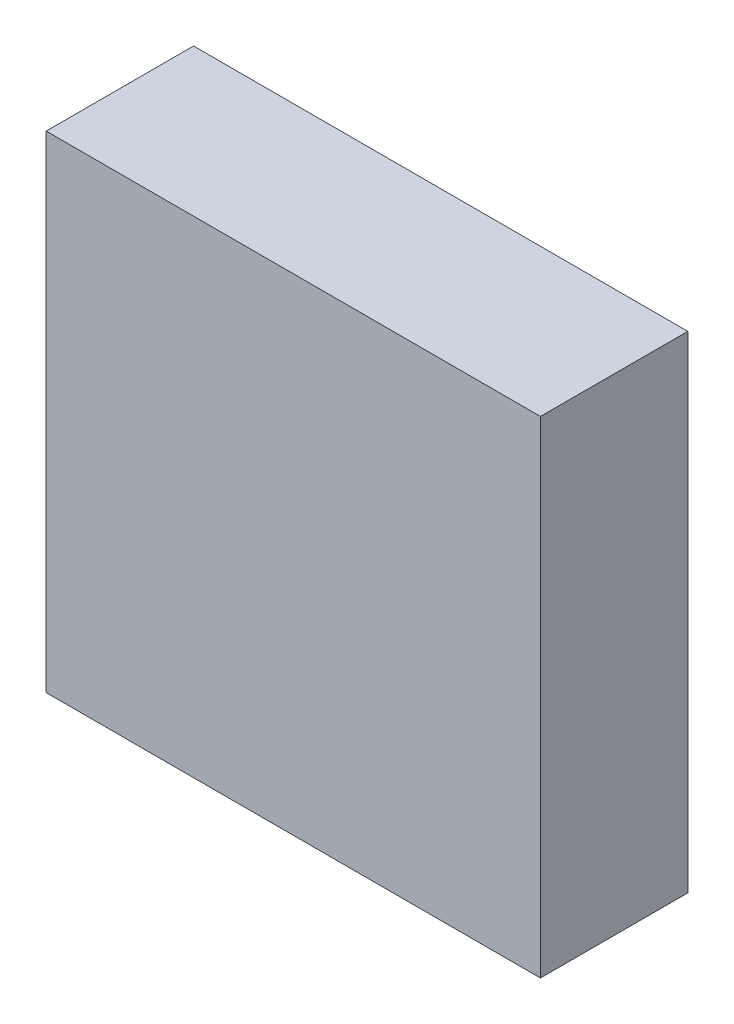
ISO-10303-21;
HEADER;
FILE_DESCRIPTION(('STEP AP214'),'2;1');
FILE_NAME('part.step','',(''),(''),'','','');
FILE_SCHEMA(('AUTOMOTIVE_DESIGN { 1 0 10303 214 1 1 1 1 }'));
ENDSEC;
DATA;
#1=APPLICATION_CONTEXT('core data for automotive mechanical design processes');
#2=APPLICATION_PROTOCOL_DEFINITION('international standard','automotive_design',2000,#1);
#3=PRODUCT_CONTEXT('',#1,'mechanical');
#4=PRODUCT('Part','Part','',(#3));
#5=PRODUCT_RELATED_PRODUCT_CATEGORY('part','',(#4));
#6=PRODUCT_DEFINITION_FORMATION('','',#4);
#7=PRODUCT_DEFINITION_CONTEXT('part definition',#1,'design');
#8=PRODUCT_DEFINITION('design','',#6,#7);
#9=PRODUCT_DEFINITION_SHAPE('','',#8);
#10=(LENGTH_UNIT() NAMED_UNIT(*) SI_UNIT(.MILLI.,.METRE.));
#11=(NAMED_UNIT(*) PLANE_ANGLE_UNIT() SI_UNIT($,.RADIAN.));
#12=(NAMED_UNIT(*) SI_UNIT($,.STERADIAN.) SOLID_ANGLE_UNIT());
#13=UNCERTAINTY_MEASURE_WITH_UNIT(LENGTH_MEASURE(1.E-05),#10,'distance_accuracy_value','');
#14=(GEOMETRIC_REPRESENTATION_CONTEXT(3) GLOBAL_UNCERTAINTY_ASSIGNED_CONTEXT((#13)) GLOBAL_UNIT_ASSIGNED_CONTEXT((#10,
#11,#12)) REPRESENTATION_CONTEXT('',''));
#15=CARTESIAN_POINT('',(0.,0.,0.));
#16=DIRECTION('',(0.,0.,1.));
#17=DIRECTION('',(1.,0.,0.));
#18=AXIS2_PLACEMENT_3D('',#15,#16,#17);
#19=CARTESIAN_POINT('',(0.,0.,1.));
#20=DIRECTION('',(0.,0.,1.));
#21=DIRECTION('',(1.,0.,0.));
#22=AXIS2_PLACEMENT_3D('',#19,#20,#21);
#23=PLANE('',#22);
#24=DIRECTION('',(1.,0.,0.));
#25=VECTOR('',#24,1.);
#26=CARTESIAN_POINT('',(-1.67691,-1.65007,1.));
#27=LINE('',#26,#25);
#28=CARTESIAN_POINT('',(-1.67691,-1.65007,1.));
#29=VERTEX_POINT('',#28);
#30=CARTESIAN_POINT('',(1.67691,-1.65007,1.));
#31=VERTEX_POINT('',#30);
#32=EDGE_CURVE('E72',#29,#31,#27,.T.);
#33=ORIENTED_EDGE('',*,*,#32,.T.);
#34=DIRECTION('',(0.,1.,0.));
#35=VECTOR('',#34,1.);
#36=CARTESIAN_POINT('',(1.67691,-1.65007,1.));
#37=LINE('',#36,#35);
#38=CARTESIAN_POINT('',(1.67691,1.65007,1.));
#39=VERTEX_POINT('',#38);
#40=EDGE_CURVE('E103',#31,#39,#37,.T.);
#41=ORIENTED_EDGE('',*,*,#40,.T.);
#42=DIRECTION('',(-1.,0.,0.));
#43=VECTOR('',#42,1.);
#44=CARTESIAN_POINT('',(1.67691,1.65007,1.));
#45=LINE('',#44,#43);
#46=CARTESIAN_POINT('',(-1.67691,1.65007,1.));
#47=VERTEX_POINT('',#46);
#48=EDGE_CURVE('E75',#39,#47,#45,.T.);
#49=ORIENTED_EDGE('',*,*,#48,.T.);
#50=DIRECTION('',(0.,-1.,0.));
#51=VECTOR('',#50,1.);
#52=CARTESIAN_POINT('',(-1.67691,1.65007,1.));
#53=LINE('',#52,#51);
#54=EDGE_CURVE('E11',#47,#29,#53,.T.);
#55=ORIENTED_EDGE('',*,*,#54,.T.);
#56=EDGE_LOOP('',(#33,#41,#49,#55));
#57=FACE_BOUND('',#56,.T.);
#58=ADVANCED_FACE('F16',(#57),#23,.T.);
#59=CARTESIAN_POINT('',(0.,0.,0.));
#60=DIRECTION('',(0.,0.,1.));
#61=DIRECTION('',(1.,0.,0.));
#62=AXIS2_PLACEMENT_3D('',#59,#60,#61);
#63=PLANE('',#62);
#64=DIRECTION('',(1.,0.,0.));
#65=VECTOR('',#64,1.);
#66=CARTESIAN_POINT('',(-1.67691,-1.65007,0.));
#67=LINE('',#66,#65);
#68=CARTESIAN_POINT('',(-1.67691,-1.65007,0.));
#69=VERTEX_POINT('',#68);
#70=CARTESIAN_POINT('',(1.67691,-1.65007,0.));
#71=VERTEX_POINT('',#70);
#72=EDGE_CURVE('E87',#69,#71,#67,.T.);
#73=ORIENTED_EDGE('',*,*,#72,.F.);
#74=DIRECTION('',(0.,-1.,0.));
#75=VECTOR('',#74,1.);
#76=CARTESIAN_POINT('',(-1.67691,1.65007,0.));
#77=LINE('',#76,#75);
#78=CARTESIAN_POINT('',(-1.67691,1.65007,0.));
#79=VERTEX_POINT('',#78);
#80=EDGE_CURVE('E27',#79,#69,#77,.T.);
#81=ORIENTED_EDGE('',*,*,#80,.F.);
#82=DIRECTION('',(-1.,0.,0.));
#83=VECTOR('',#82,1.);
#84=CARTESIAN_POINT('',(1.67691,1.65007,0.));
#85=LINE('',#84,#83);
#86=CARTESIAN_POINT('',(1.67691,1.65007,0.));
#87=VERTEX_POINT('',#86);
#88=EDGE_CURVE('E98',#87,#79,#85,.T.);
#89=ORIENTED_EDGE('',*,*,#88,.F.);
#90=DIRECTION('',(0.,1.,0.));
#91=VECTOR('',#90,1.);
#92=CARTESIAN_POINT('',(1.67691,-1.65007,0.));
#93=LINE('',#92,#91);
#94=EDGE_CURVE('E60',#71,#87,#93,.T.);
#95=ORIENTED_EDGE('',*,*,#94,.F.);
#96=EDGE_LOOP('',(#73,#81,#89,#95));
#97=FACE_BOUND('',#96,.T.);
#98=ADVANCED_FACE('F18',(#97),#63,.F.);
#99=CARTESIAN_POINT('',(-1.67691,1.65007,0.));
#100=DIRECTION('',(1.,0.,0.));
#101=DIRECTION('',(0.,1.,0.));
#102=AXIS2_PLACEMENT_3D('',#99,#100,#101);
#103=PLANE('',#102);
#104=DIRECTION('',(0.,0.,1.));
#105=VECTOR('',#104,1.);
#106=CARTESIAN_POINT('',(-1.67691,1.65007,0.));
#107=LINE('',#106,#105);
#108=EDGE_CURVE('E102',#79,#47,#107,.T.);
#109=ORIENTED_EDGE('',*,*,#108,.F.);
#110=ORIENTED_EDGE('',*,*,#80,.T.);
#111=DIRECTION('',(0.,0.,1.));
#112=VECTOR('',#111,1.);
#113=CARTESIAN_POINT('',(-1.67691,-1.65007,0.));
#114=LINE('',#113,#112);
#115=EDGE_CURVE('E81',#69,#29,#114,.T.);
#116=ORIENTED_EDGE('',*,*,#115,.T.);
#117=ORIENTED_EDGE('',*,*,#54,.F.);
#118=EDGE_LOOP('',(#109,#110,#116,#117));
#119=FACE_BOUND('',#118,.T.);
#120=ADVANCED_FACE('F85',(#119),#103,.F.);
#121=CARTESIAN_POINT('',(1.67691,1.65007,0.));
#122=DIRECTION('',(0.,-1.,0.));
#123=DIRECTION('',(0.,0.,-1.));
#124=AXIS2_PLACEMENT_3D('',#121,#122,#123);
#125=PLANE('',#124);
#126=DIRECTION('',(0.,0.,1.));
#127=VECTOR('',#126,1.);
#128=CARTESIAN_POINT('',(1.67691,1.65007,0.));
#129=LINE('',#128,#127);
#130=EDGE_CURVE('E20',#87,#39,#129,.T.);
#131=ORIENTED_EDGE('',*,*,#130,.F.);
#132=ORIENTED_EDGE('',*,*,#88,.T.);
#133=ORIENTED_EDGE('',*,*,#108,.T.);
#134=ORIENTED_EDGE('',*,*,#48,.F.);
#135=EDGE_LOOP('',(#131,#132,#133,#134));
#136=FACE_BOUND('',#135,.T.);
#137=ADVANCED_FACE('F110',(#136),#125,.F.);
#138=CARTESIAN_POINT('',(1.67691,-1.65007,0.));
#139=DIRECTION('',(-1.,0.,0.));
#140=DIRECTION('',(0.,0.,1.));
#141=AXIS2_PLACEMENT_3D('',#138,#139,#140);
#142=PLANE('',#141);
#143=DIRECTION('',(0.,0.,1.));
#144=VECTOR('',#143,1.);
#145=CARTESIAN_POINT('',(1.67691,-1.65007,0.));
#146=LINE('',#145,#144);
#147=EDGE_CURVE('E82',#71,#31,#146,.T.);
#148=ORIENTED_EDGE('',*,*,#147,.F.);
#149=ORIENTED_EDGE('',*,*,#94,.T.);
#150=ORIENTED_EDGE('',*,*,#130,.T.);
#151=ORIENTED_EDGE('',*,*,#40,.F.);
#152=EDGE_LOOP('',(#148,#149,#150,#151));
#153=FACE_BOUND('',#152,.T.);
#154=ADVANCED_FACE('F133',(#153),#142,.F.);
#155=CARTESIAN_POINT('',(-1.67691,-1.65007,0.));
#156=DIRECTION('',(0.,1.,0.));
#157=DIRECTION('',(1.,0.,0.));
#158=AXIS2_PLACEMENT_3D('',#155,#156,#157);
#159=PLANE('',#158);
#160=ORIENTED_EDGE('',*,*,#115,.F.);
#161=ORIENTED_EDGE('',*,*,#72,.T.);
#162=ORIENTED_EDGE('',*,*,#147,.T.);
#163=ORIENTED_EDGE('',*,*,#32,.F.);
#164=EDGE_LOOP('',(#160,#161,#162,#163));
#165=FACE_BOUND('',#164,.T.);
#166=ADVANCED_FACE('F79',(#165),#159,.F.);
#167=CLOSED_SHELL('',(#58,#98,#120,#137,#154,#166));
#168=MANIFOLD_SOLID_BREP('B1',#167);
#169=ADVANCED_BREP_SHAPE_REPRESENTATION('',(#18,#168),#14);
#170=SHAPE_DEFINITION_REPRESENTATION(#9,#169);
ENDSEC;
END-ISO-10303-21;
